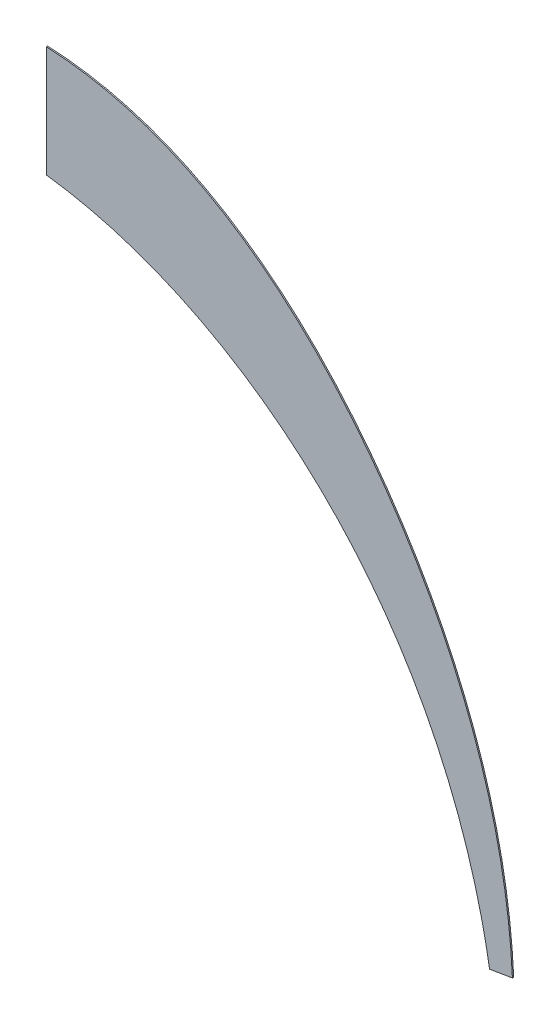
ISO-10303-21;
HEADER;
FILE_DESCRIPTION(('STEP AP214'),'2;1');
FILE_NAME('part.step','',(''),(''),'','','');
FILE_SCHEMA(('AUTOMOTIVE_DESIGN { 1 0 10303 214 1 1 1 1 }'));
ENDSEC;
DATA;
#1=APPLICATION_CONTEXT('core data for automotive mechanical design processes');
#2=APPLICATION_PROTOCOL_DEFINITION('international standard','automotive_design',2000,#1);
#3=PRODUCT_CONTEXT('',#1,'mechanical');
#4=PRODUCT('Part','Part','',(#3));
#5=PRODUCT_RELATED_PRODUCT_CATEGORY('part','',(#4));
#6=PRODUCT_DEFINITION_FORMATION('','',#4);
#7=PRODUCT_DEFINITION_CONTEXT('part definition',#1,'design');
#8=PRODUCT_DEFINITION('design','',#6,#7);
#9=PRODUCT_DEFINITION_SHAPE('','',#8);
#10=(LENGTH_UNIT() NAMED_UNIT(*) SI_UNIT(.MILLI.,.METRE.));
#11=(NAMED_UNIT(*) PLANE_ANGLE_UNIT() SI_UNIT($,.RADIAN.));
#12=(NAMED_UNIT(*) SI_UNIT($,.STERADIAN.) SOLID_ANGLE_UNIT());
#13=UNCERTAINTY_MEASURE_WITH_UNIT(LENGTH_MEASURE(1.E-05),#10,'distance_accuracy_value','');
#14=(GEOMETRIC_REPRESENTATION_CONTEXT(3) GLOBAL_UNCERTAINTY_ASSIGNED_CONTEXT((#13)) GLOBAL_UNIT_ASSIGNED_CONTEXT((#10,
#11,#12)) REPRESENTATION_CONTEXT('',''));
#15=CARTESIAN_POINT('',(0.,0.,0.));
#16=DIRECTION('',(0.,0.,1.));
#17=DIRECTION('',(1.,0.,0.));
#18=AXIS2_PLACEMENT_3D('',#15,#16,#17);
#19=CARTESIAN_POINT('',(0.,0.,0.5));
#20=CARTESIAN_POINT('',(46.1208654149444,-5.80364264497784,0.5));
#21=CARTESIAN_POINT('',(127.896217096042,-53.8712038025124,0.5));
#22=CARTESIAN_POINT('',(164.721375091274,-138.849603881884,0.5));
#23=CARTESIAN_POINT('',(171.668005285004,-180.545194688111,0.5));
#24=B_SPLINE_CURVE_WITH_KNOTS('',3,(#19,#20,#21,#22,#23),.UNSPECIFIED.,.F.,.F.,(4,1,4),(0.,
0.520944633740313,1.),.UNSPECIFIED.);
#25=DIRECTION('',(0.,0.,-1.));
#26=VECTOR('',#25,1.);
#27=SURFACE_OF_LINEAR_EXTRUSION('',#24,#26);
#28=CARTESIAN_POINT('',(0.,0.,0.));
#29=CARTESIAN_POINT('',(46.1208654149444,-5.80364264497784,0.));
#30=CARTESIAN_POINT('',(127.896217096042,-53.8712038025124,0.));
#31=CARTESIAN_POINT('',(164.721375091274,-138.849603881884,0.));
#32=CARTESIAN_POINT('',(171.668005285004,-180.545194688111,0.));
#33=B_SPLINE_CURVE_WITH_KNOTS('',3,(#28,#29,#30,#31,#32),.UNSPECIFIED.,.F.,.F.,(4,1,4),(0.,
0.520944633740313,1.),.UNSPECIFIED.);
#34=CARTESIAN_POINT('',(0.,0.,0.));
#35=VERTEX_POINT('',#34);
#36=CARTESIAN_POINT('',(171.668005285004,-180.545194688111,0.));
#37=VERTEX_POINT('',#36);
#38=EDGE_CURVE('E125',#35,#37,#33,.T.);
#39=ORIENTED_EDGE('',*,*,#38,.T.);
#40=DIRECTION('',(0.,0.,-1.));
#41=VECTOR('',#40,1.);
#42=CARTESIAN_POINT('',(171.668005285004,-180.545194688111,0.5));
#43=LINE('',#42,#41);
#44=CARTESIAN_POINT('',(171.668005285004,-180.545194688111,0.5));
#45=VERTEX_POINT('',#44);
#46=EDGE_CURVE('E11',#45,#37,#43,.T.);
#47=ORIENTED_EDGE('',*,*,#46,.F.);
#48=CARTESIAN_POINT('',(0.,0.,0.5));
#49=VERTEX_POINT('',#48);
#50=EDGE_CURVE('E82',#49,#45,#24,.T.);
#51=ORIENTED_EDGE('',*,*,#50,.F.);
#52=DIRECTION('',(0.,0.,-1.));
#53=VECTOR('',#52,1.);
#54=CARTESIAN_POINT('',(0.,0.,0.5));
#55=LINE('',#54,#53);
#56=EDGE_CURVE('E58',#49,#35,#55,.T.);
#57=ORIENTED_EDGE('',*,*,#56,.T.);
#58=EDGE_LOOP('',(#39,#47,#51,#57));
#59=FACE_BOUND('',#58,.T.);
#60=ADVANCED_FACE('F40',(#59),#27,.F.);
#61=CARTESIAN_POINT('',(180.513560886091,-179.070151114934,0.5));
#62=DIRECTION('',(0.164484081983477,-0.986379737613285,0.));
#63=DIRECTION('',(0.986379737613285,0.164484081983477,0.));
#64=AXIS2_PLACEMENT_3D('',#61,#62,#63);
#65=PLANE('',#64);
#66=DIRECTION('',(-0.986379737613285,-0.164484081983477,0.));
#67=VECTOR('',#66,1.);
#68=CARTESIAN_POINT('',(180.513560886091,-179.070151114934,0.));
#69=LINE('',#68,#67);
#70=CARTESIAN_POINT('',(180.513560886091,-179.070151114934,0.));
#71=VERTEX_POINT('',#70);
#72=EDGE_CURVE('E91',#71,#37,#69,.T.);
#73=ORIENTED_EDGE('',*,*,#72,.F.);
#74=DIRECTION('',(0.,0.,-1.));
#75=VECTOR('',#74,1.);
#76=CARTESIAN_POINT('',(180.513560886091,-179.070151114934,0.5));
#77=LINE('',#76,#75);
#78=CARTESIAN_POINT('',(180.513560886091,-179.070151114934,0.5));
#79=VERTEX_POINT('',#78);
#80=EDGE_CURVE('E50',#79,#71,#77,.T.);
#81=ORIENTED_EDGE('',*,*,#80,.F.);
#82=DIRECTION('',(-0.986379737613285,-0.164484081983477,0.));
#83=VECTOR('',#82,1.);
#84=CARTESIAN_POINT('',(180.513560886091,-179.070151114934,0.5));
#85=LINE('',#84,#83);
#86=EDGE_CURVE('E89',#79,#45,#85,.T.);
#87=ORIENTED_EDGE('',*,*,#86,.T.);
#88=ORIENTED_EDGE('',*,*,#46,.T.);
#89=EDGE_LOOP('',(#73,#81,#87,#88));
#90=FACE_BOUND('',#89,.T.);
#91=ADVANCED_FACE('F88',(#90),#65,.T.);
#92=CARTESIAN_POINT('',(0.,43.0018182318556,0.5));
#93=CARTESIAN_POINT('',(58.8651485896487,40.4230198227262,0.5));
#94=CARTESIAN_POINT('',(143.19810325099,-32.0858820345997,0.5));
#95=CARTESIAN_POINT('',(178.260941681333,-131.126086470626,0.5));
#96=CARTESIAN_POINT('',(180.513560886091,-179.070151114934,0.5));
#97=B_SPLINE_CURVE_WITH_KNOTS('',3,(#92,#93,#94,#95,#96),.UNSPECIFIED.,.F.,.F.,(4,1,4),(0.,
0.539710770362279,1.),.UNSPECIFIED.);
#98=DIRECTION('',(0.,0.,-1.));
#99=VECTOR('',#98,1.);
#100=SURFACE_OF_LINEAR_EXTRUSION('',#97,#99);
#101=CARTESIAN_POINT('',(0.,43.0018182318556,0.));
#102=CARTESIAN_POINT('',(58.8651485896487,40.4230198227262,0.));
#103=CARTESIAN_POINT('',(143.19810325099,-32.0858820345997,0.));
#104=CARTESIAN_POINT('',(178.260941681333,-131.126086470626,0.));
#105=CARTESIAN_POINT('',(180.513560886091,-179.070151114934,0.));
#106=B_SPLINE_CURVE_WITH_KNOTS('',3,(#101,#102,#103,#104,#105),.UNSPECIFIED.,.F.,.F.,(4,1,4),
(0.,0.539710770362279,1.),.UNSPECIFIED.);
#107=CARTESIAN_POINT('',(0.,43.0018182318556,0.));
#108=VERTEX_POINT('',#107);
#109=EDGE_CURVE('E130',#108,#71,#106,.T.);
#110=ORIENTED_EDGE('',*,*,#109,.F.);
#111=DIRECTION('',(0.,0.,-1.));
#112=VECTOR('',#111,1.);
#113=CARTESIAN_POINT('',(0.,43.0018182318556,0.5));
#114=LINE('',#113,#112);
#115=CARTESIAN_POINT('',(0.,43.0018182318556,0.5));
#116=VERTEX_POINT('',#115);
#117=EDGE_CURVE('E71',#116,#108,#114,.T.);
#118=ORIENTED_EDGE('',*,*,#117,.F.);
#119=EDGE_CURVE('E98',#116,#79,#97,.T.);
#120=ORIENTED_EDGE('',*,*,#119,.T.);
#121=ORIENTED_EDGE('',*,*,#80,.T.);
#122=EDGE_LOOP('',(#110,#118,#120,#121));
#123=FACE_BOUND('',#122,.T.);
#124=ADVANCED_FACE('F101',(#123),#100,.T.);
#125=CARTESIAN_POINT('',(0.,0.,0.5));
#126=DIRECTION('',(-1.,0.,0.));
#127=DIRECTION('',(0.,0.,1.));
#128=AXIS2_PLACEMENT_3D('',#125,#126,#127);
#129=PLANE('',#128);
#130=DIRECTION('',(0.,1.,0.));
#131=VECTOR('',#130,1.);
#132=CARTESIAN_POINT('',(0.,0.,0.));
#133=LINE('',#132,#131);
#134=EDGE_CURVE('E134',#35,#108,#133,.T.);
#135=ORIENTED_EDGE('',*,*,#134,.F.);
#136=ORIENTED_EDGE('',*,*,#56,.F.);
#137=DIRECTION('',(0.,1.,0.));
#138=VECTOR('',#137,1.);
#139=CARTESIAN_POINT('',(0.,0.,0.5));
#140=LINE('',#139,#138);
#141=EDGE_CURVE('E103',#49,#116,#140,.T.);
#142=ORIENTED_EDGE('',*,*,#141,.T.);
#143=ORIENTED_EDGE('',*,*,#117,.T.);
#144=EDGE_LOOP('',(#135,#136,#142,#143));
#145=FACE_BOUND('',#144,.T.);
#146=ADVANCED_FACE('F117',(#145),#129,.T.);
#147=CARTESIAN_POINT('',(115.397491908243,-61.7224052277679,0.5));
#148=DIRECTION('',(0.,0.,1.));
#149=DIRECTION('',(1.,0.,0.));
#150=AXIS2_PLACEMENT_3D('',#147,#148,#149);
#151=PLANE('',#150);
#152=ORIENTED_EDGE('',*,*,#50,.T.);
#153=ORIENTED_EDGE('',*,*,#86,.F.);
#154=ORIENTED_EDGE('',*,*,#119,.F.);
#155=ORIENTED_EDGE('',*,*,#141,.F.);
#156=EDGE_LOOP('',(#152,#153,#154,#155));
#157=FACE_BOUND('',#156,.T.);
#158=ADVANCED_FACE('F97',(#157),#151,.T.);
#159=CARTESIAN_POINT('',(115.397491908243,-61.7224052277679,0.));
#160=DIRECTION('',(0.,0.,1.));
#161=DIRECTION('',(1.,0.,0.));
#162=AXIS2_PLACEMENT_3D('',#159,#160,#161);
#163=PLANE('',#162);
#164=ORIENTED_EDGE('',*,*,#38,.F.);
#165=ORIENTED_EDGE('',*,*,#134,.T.);
#166=ORIENTED_EDGE('',*,*,#109,.T.);
#167=ORIENTED_EDGE('',*,*,#72,.T.);
#168=EDGE_LOOP('',(#164,#165,#166,#167));
#169=FACE_BOUND('',#168,.T.);
#170=ADVANCED_FACE('F129',(#169),#163,.F.);
#171=CLOSED_SHELL('',(#60,#91,#124,#146,#158,#170));
#172=MANIFOLD_SOLID_BREP('B2',#171);
#173=ADVANCED_BREP_SHAPE_REPRESENTATION('',(#18,#172),#14);
#174=SHAPE_DEFINITION_REPRESENTATION(#9,#173);
ENDSEC;
END-ISO-10303-21;
